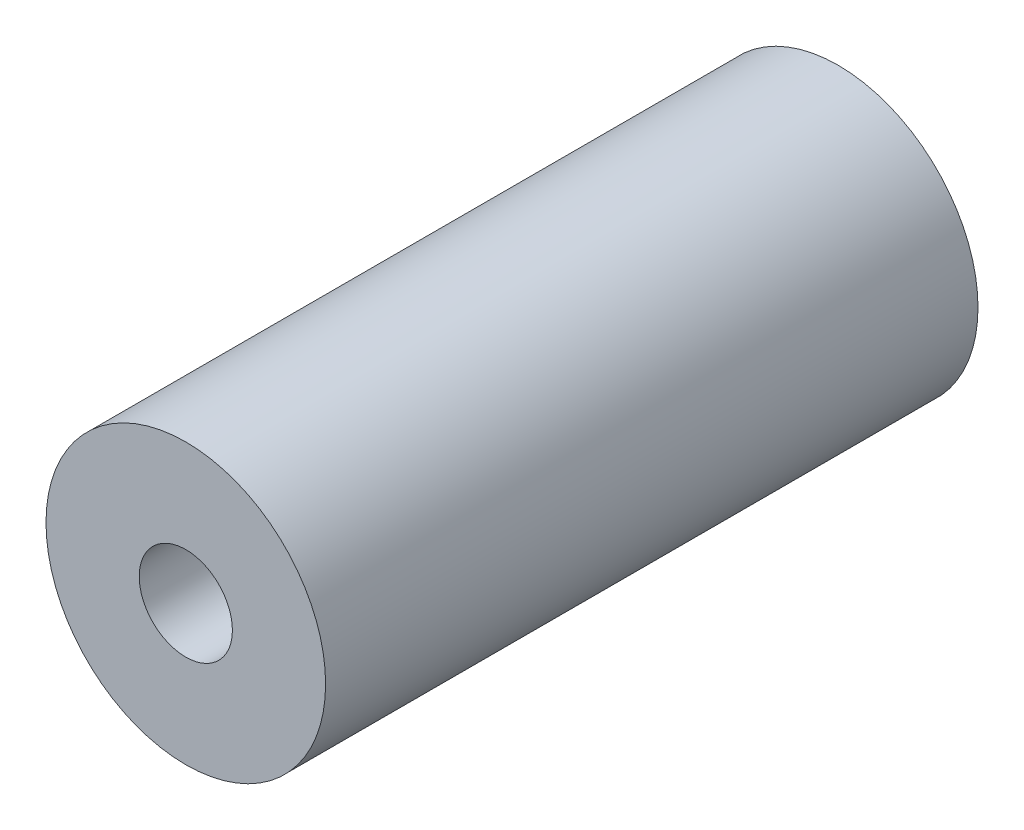
ISO-10303-21;
HEADER;
FILE_DESCRIPTION(('STEP AP214'),'2;1');
FILE_NAME('part.step','',(''),(''),'','','');
FILE_SCHEMA(('AUTOMOTIVE_DESIGN { 1 0 10303 214 1 1 1 1 }'));
ENDSEC;
DATA;
#1=APPLICATION_CONTEXT('core data for automotive mechanical design processes');
#2=APPLICATION_PROTOCOL_DEFINITION('international standard','automotive_design',2000,#1);
#3=PRODUCT_CONTEXT('',#1,'mechanical');
#4=PRODUCT('Part','Part','',(#3));
#5=PRODUCT_RELATED_PRODUCT_CATEGORY('part','',(#4));
#6=PRODUCT_DEFINITION_FORMATION('','',#4);
#7=PRODUCT_DEFINITION_CONTEXT('part definition',#1,'design');
#8=PRODUCT_DEFINITION('design','',#6,#7);
#9=PRODUCT_DEFINITION_SHAPE('','',#8);
#10=(LENGTH_UNIT() NAMED_UNIT(*) SI_UNIT(.MILLI.,.METRE.));
#11=(NAMED_UNIT(*) PLANE_ANGLE_UNIT() SI_UNIT($,.RADIAN.));
#12=(NAMED_UNIT(*) SI_UNIT($,.STERADIAN.) SOLID_ANGLE_UNIT());
#13=UNCERTAINTY_MEASURE_WITH_UNIT(LENGTH_MEASURE(1.E-05),#10,'distance_accuracy_value','');
#14=(GEOMETRIC_REPRESENTATION_CONTEXT(3) GLOBAL_UNCERTAINTY_ASSIGNED_CONTEXT((#13)) GLOBAL_UNIT_ASSIGNED_CONTEXT((#10,
#11,#12)) REPRESENTATION_CONTEXT('',''));
#15=CARTESIAN_POINT('',(0.,0.,0.));
#16=DIRECTION('',(0.,0.,1.));
#17=DIRECTION('',(1.,0.,0.));
#18=AXIS2_PLACEMENT_3D('',#15,#16,#17);
#19=CARTESIAN_POINT('',(0.,0.,14.));
#20=DIRECTION('',(0.,0.,1.));
#21=DIRECTION('',(1.,0.,0.));
#22=AXIS2_PLACEMENT_3D('',#19,#20,#21);
#23=PLANE('',#22);
#24=CARTESIAN_POINT('',(0.,0.,14.));
#25=DIRECTION('',(0.,0.,1.));
#26=DIRECTION('',(1.,0.,0.));
#27=AXIS2_PLACEMENT_3D('',#24,#25,#26);
#28=CIRCLE('',#27,3.);
#29=CARTESIAN_POINT('',(3.,0.,14.));
#30=VERTEX_POINT('',#29);
#31=EDGE_CURVE('E10',#30,#30,#28,.T.);
#32=ORIENTED_EDGE('',*,*,#31,.T.);
#33=EDGE_LOOP('',(#32));
#34=FACE_BOUND('',#33,.T.);
#35=CARTESIAN_POINT('',(0.,0.,14.));
#36=DIRECTION('',(0.,0.,1.));
#37=DIRECTION('',(1.,0.,0.));
#38=AXIS2_PLACEMENT_3D('',#35,#36,#37);
#39=CIRCLE('',#38,1.);
#40=CARTESIAN_POINT('',(1.,0.,14.));
#41=VERTEX_POINT('',#40);
#42=EDGE_CURVE('E47',#41,#41,#39,.T.);
#43=ORIENTED_EDGE('',*,*,#42,.F.);
#44=EDGE_LOOP('',(#43));
#45=FACE_BOUND('',#44,.T.);
#46=ADVANCED_FACE('F36',(#34,#45),#23,.T.);
#47=CARTESIAN_POINT('',(0.,0.,0.));
#48=DIRECTION('',(0.,0.,1.));
#49=DIRECTION('',(1.,0.,0.));
#50=AXIS2_PLACEMENT_3D('',#47,#48,#49);
#51=PLANE('',#50);
#52=CARTESIAN_POINT('',(0.,0.,0.));
#53=DIRECTION('',(0.,0.,1.));
#54=DIRECTION('',(1.,0.,0.));
#55=AXIS2_PLACEMENT_3D('',#52,#53,#54);
#56=CIRCLE('',#55,3.);
#57=CARTESIAN_POINT('',(3.,0.,0.));
#58=VERTEX_POINT('',#57);
#59=EDGE_CURVE('E40',#58,#58,#56,.T.);
#60=ORIENTED_EDGE('',*,*,#59,.F.);
#61=EDGE_LOOP('',(#60));
#62=FACE_BOUND('',#61,.T.);
#63=CARTESIAN_POINT('',(0.,0.,0.));
#64=DIRECTION('',(0.,0.,1.));
#65=DIRECTION('',(1.,0.,0.));
#66=AXIS2_PLACEMENT_3D('',#63,#64,#65);
#67=CIRCLE('',#66,1.);
#68=CARTESIAN_POINT('',(1.,0.,0.));
#69=VERTEX_POINT('',#68);
#70=EDGE_CURVE('E49',#69,#69,#67,.T.);
#71=ORIENTED_EDGE('',*,*,#70,.T.);
#72=EDGE_LOOP('',(#71));
#73=FACE_BOUND('',#72,.T.);
#74=ADVANCED_FACE('F59',(#62,#73),#51,.F.);
#75=CARTESIAN_POINT('',(0.,0.,14.));
#76=DIRECTION('',(0.,0.,-1.));
#77=DIRECTION('',(-1.,0.,0.));
#78=AXIS2_PLACEMENT_3D('',#75,#76,#77);
#79=CYLINDRICAL_SURFACE('',#78,3.);
#80=ORIENTED_EDGE('',*,*,#31,.F.);
#81=EDGE_LOOP('',(#80));
#82=FACE_BOUND('',#81,.T.);
#83=ORIENTED_EDGE('',*,*,#59,.T.);
#84=EDGE_LOOP('',(#83));
#85=FACE_BOUND('',#84,.T.);
#86=ADVANCED_FACE('F38',(#82,#85),#79,.T.);
#87=CARTESIAN_POINT('',(0.,0.,14.));
#88=DIRECTION('',(0.,0.,-1.));
#89=DIRECTION('',(-1.,0.,0.));
#90=AXIS2_PLACEMENT_3D('',#87,#88,#89);
#91=CYLINDRICAL_SURFACE('',#90,1.);
#92=ORIENTED_EDGE('',*,*,#42,.T.);
#93=EDGE_LOOP('',(#92));
#94=FACE_BOUND('',#93,.T.);
#95=ORIENTED_EDGE('',*,*,#70,.F.);
#96=EDGE_LOOP('',(#95));
#97=FACE_BOUND('',#96,.T.);
#98=ADVANCED_FACE('F55',(#94,#97),#91,.F.);
#99=CLOSED_SHELL('',(#46,#74,#86,#98));
#100=MANIFOLD_SOLID_BREP('B2',#99);
#101=ADVANCED_BREP_SHAPE_REPRESENTATION('',(#18,#100),#14);
#102=SHAPE_DEFINITION_REPRESENTATION(#9,#101);
ENDSEC;
END-ISO-10303-21;
